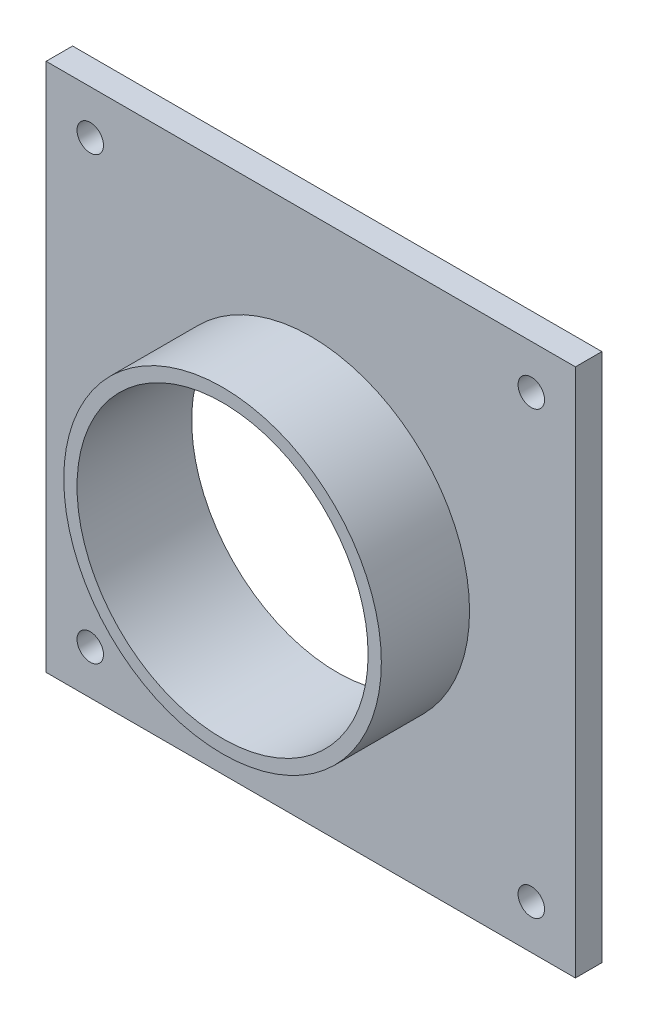
ISO-10303-21;
HEADER;
FILE_DESCRIPTION(('STEP AP214'),'2;1');
FILE_NAME('part.step','',(''),(''),'','','');
FILE_SCHEMA(('AUTOMOTIVE_DESIGN { 1 0 10303 214 1 1 1 1 }'));
ENDSEC;
DATA;
#1=APPLICATION_CONTEXT('core data for automotive mechanical design processes');
#2=APPLICATION_PROTOCOL_DEFINITION('international standard','automotive_design',2000,#1);
#3=PRODUCT_CONTEXT('',#1,'mechanical');
#4=PRODUCT('Part','Part','',(#3));
#5=PRODUCT_RELATED_PRODUCT_CATEGORY('part','',(#4));
#6=PRODUCT_DEFINITION_FORMATION('','',#4);
#7=PRODUCT_DEFINITION_CONTEXT('part definition',#1,'design');
#8=PRODUCT_DEFINITION('design','',#6,#7);
#9=PRODUCT_DEFINITION_SHAPE('','',#8);
#10=(LENGTH_UNIT() NAMED_UNIT(*) SI_UNIT(.MILLI.,.METRE.));
#11=(NAMED_UNIT(*) PLANE_ANGLE_UNIT() SI_UNIT($,.RADIAN.));
#12=(NAMED_UNIT(*) SI_UNIT($,.STERADIAN.) SOLID_ANGLE_UNIT());
#13=UNCERTAINTY_MEASURE_WITH_UNIT(LENGTH_MEASURE(1.E-05),#10,'distance_accuracy_value','');
#14=(GEOMETRIC_REPRESENTATION_CONTEXT(3) GLOBAL_UNCERTAINTY_ASSIGNED_CONTEXT((#13)) GLOBAL_UNIT_ASSIGNED_CONTEXT((#10,
#11,#12)) REPRESENTATION_CONTEXT('',''));
#15=CARTESIAN_POINT('',(0.,0.,0.));
#16=DIRECTION('',(0.,0.,1.));
#17=DIRECTION('',(1.,0.,0.));
#18=AXIS2_PLACEMENT_3D('',#15,#16,#17);
#19=CARTESIAN_POINT('',(0.,0.,3.));
#20=DIRECTION('',(0.,0.,1.));
#21=DIRECTION('',(1.,0.,0.));
#22=AXIS2_PLACEMENT_3D('',#19,#20,#21);
#23=PLANE('',#22);
#24=CARTESIAN_POINT('',(5.,5.,3.));
#25=DIRECTION('',(0.,0.,1.));
#26=DIRECTION('',(-1.,0.,0.));
#27=AXIS2_PLACEMENT_3D('',#24,#25,#26);
#28=CIRCLE('',#27,1.5);
#29=CARTESIAN_POINT('',(3.5,5.,3.));
#30=VERTEX_POINT('',#29);
#31=EDGE_CURVE('E131',#30,#30,#28,.T.);
#32=ORIENTED_EDGE('',*,*,#31,.F.);
#33=EDGE_LOOP('',(#32));
#34=FACE_BOUND('',#33,.T.);
#35=CARTESIAN_POINT('',(55.,55.,3.));
#36=DIRECTION('',(0.,0.,1.));
#37=DIRECTION('',(-1.,0.,0.));
#38=AXIS2_PLACEMENT_3D('',#35,#36,#37);
#39=CIRCLE('',#38,1.5);
#40=CARTESIAN_POINT('',(53.5,55.,3.));
#41=VERTEX_POINT('',#40);
#42=EDGE_CURVE('E119',#41,#41,#39,.T.);
#43=ORIENTED_EDGE('',*,*,#42,.F.);
#44=EDGE_LOOP('',(#43));
#45=FACE_BOUND('',#44,.T.);
#46=DIRECTION('',(0.,-1.,0.));
#47=VECTOR('',#46,1.);
#48=CARTESIAN_POINT('',(0.,60.,3.));
#49=LINE('',#48,#47);
#50=CARTESIAN_POINT('',(0.,60.,3.));
#51=VERTEX_POINT('',#50);
#52=CARTESIAN_POINT('',(0.,0.,3.));
#53=VERTEX_POINT('',#52);
#54=EDGE_CURVE('E86',#51,#53,#49,.T.);
#55=ORIENTED_EDGE('',*,*,#54,.T.);
#56=DIRECTION('',(1.,0.,0.));
#57=VECTOR('',#56,1.);
#58=CARTESIAN_POINT('',(0.,0.,3.));
#59=LINE('',#58,#57);
#60=CARTESIAN_POINT('',(60.,0.,3.));
#61=VERTEX_POINT('',#60);
#62=EDGE_CURVE('E81',#53,#61,#59,.T.);
#63=ORIENTED_EDGE('',*,*,#62,.T.);
#64=DIRECTION('',(0.,1.,0.));
#65=VECTOR('',#64,1.);
#66=CARTESIAN_POINT('',(60.,0.,3.));
#67=LINE('',#66,#65);
#68=CARTESIAN_POINT('',(60.,60.,3.));
#69=VERTEX_POINT('',#68);
#70=EDGE_CURVE('E84',#61,#69,#67,.T.);
#71=ORIENTED_EDGE('',*,*,#70,.T.);
#72=DIRECTION('',(-1.,0.,0.));
#73=VECTOR('',#72,1.);
#74=CARTESIAN_POINT('',(60.,60.,3.));
#75=LINE('',#74,#73);
#76=EDGE_CURVE('E51',#69,#51,#75,.T.);
#77=ORIENTED_EDGE('',*,*,#76,.T.);
#78=EDGE_LOOP('',(#55,#63,#71,#77));
#79=FACE_BOUND('',#78,.T.);
#80=CARTESIAN_POINT('',(5.,55.,3.));
#81=DIRECTION('',(0.,0.,1.));
#82=DIRECTION('',(1.,0.,0.));
#83=AXIS2_PLACEMENT_3D('',#80,#81,#82);
#84=CIRCLE('',#83,1.5);
#85=CARTESIAN_POINT('',(6.5,55.,3.));
#86=VERTEX_POINT('',#85);
#87=EDGE_CURVE('E115',#86,#86,#84,.T.);
#88=ORIENTED_EDGE('',*,*,#87,.F.);
#89=EDGE_LOOP('',(#88));
#90=FACE_BOUND('',#89,.T.);
#91=CARTESIAN_POINT('',(55.,5.,3.));
#92=DIRECTION('',(0.,0.,1.));
#93=DIRECTION('',(1.,0.,0.));
#94=AXIS2_PLACEMENT_3D('',#91,#92,#93);
#95=CIRCLE('',#94,1.5);
#96=CARTESIAN_POINT('',(56.5,5.,3.));
#97=VERTEX_POINT('',#96);
#98=EDGE_CURVE('E125',#97,#97,#95,.T.);
#99=ORIENTED_EDGE('',*,*,#98,.F.);
#100=EDGE_LOOP('',(#99));
#101=FACE_BOUND('',#100,.T.);
#102=CARTESIAN_POINT('',(30.,30.,3.));
#103=DIRECTION('',(0.,0.,1.));
#104=DIRECTION('',(1.,0.,0.));
#105=AXIS2_PLACEMENT_3D('',#102,#103,#104);
#106=CIRCLE('',#105,18.);
#107=CARTESIAN_POINT('',(48.,30.,3.));
#108=VERTEX_POINT('',#107);
#109=EDGE_CURVE('E140',#108,#108,#106,.T.);
#110=ORIENTED_EDGE('',*,*,#109,.F.);
#111=EDGE_LOOP('',(#110));
#112=FACE_BOUND('',#111,.T.);
#113=ADVANCED_FACE('F34',(#34,#45,#79,#90,#101,#112),#23,.T.);
#114=CARTESIAN_POINT('',(0.,0.,0.));
#115=DIRECTION('',(0.,0.,1.));
#116=DIRECTION('',(1.,0.,0.));
#117=AXIS2_PLACEMENT_3D('',#114,#115,#116);
#118=PLANE('',#117);
#119=DIRECTION('',(0.,-1.,0.));
#120=VECTOR('',#119,1.);
#121=CARTESIAN_POINT('',(0.,60.,0.));
#122=LINE('',#121,#120);
#123=CARTESIAN_POINT('',(0.,60.,0.));
#124=VERTEX_POINT('',#123);
#125=CARTESIAN_POINT('',(0.,0.,0.));
#126=VERTEX_POINT('',#125);
#127=EDGE_CURVE('E98',#124,#126,#122,.T.);
#128=ORIENTED_EDGE('',*,*,#127,.F.);
#129=DIRECTION('',(-1.,0.,0.));
#130=VECTOR('',#129,1.);
#131=CARTESIAN_POINT('',(60.,60.,0.));
#132=LINE('',#131,#130);
#133=CARTESIAN_POINT('',(60.,60.,0.));
#134=VERTEX_POINT('',#133);
#135=EDGE_CURVE('E74',#134,#124,#132,.T.);
#136=ORIENTED_EDGE('',*,*,#135,.F.);
#137=DIRECTION('',(0.,1.,0.));
#138=VECTOR('',#137,1.);
#139=CARTESIAN_POINT('',(60.,0.,0.));
#140=LINE('',#139,#138);
#141=CARTESIAN_POINT('',(60.,0.,0.));
#142=VERTEX_POINT('',#141);
#143=EDGE_CURVE('E68',#142,#134,#140,.T.);
#144=ORIENTED_EDGE('',*,*,#143,.F.);
#145=DIRECTION('',(1.,0.,0.));
#146=VECTOR('',#145,1.);
#147=CARTESIAN_POINT('',(0.,0.,0.));
#148=LINE('',#147,#146);
#149=EDGE_CURVE('E90',#126,#142,#148,.T.);
#150=ORIENTED_EDGE('',*,*,#149,.F.);
#151=EDGE_LOOP('',(#128,#136,#144,#150));
#152=FACE_BOUND('',#151,.T.);
#153=CARTESIAN_POINT('',(30.,30.,0.));
#154=DIRECTION('',(0.,0.,1.));
#155=DIRECTION('',(1.,0.,0.));
#156=AXIS2_PLACEMENT_3D('',#153,#154,#155);
#157=CIRCLE('',#156,16.5);
#158=CARTESIAN_POINT('',(46.5,30.,0.));
#159=VERTEX_POINT('',#158);
#160=EDGE_CURVE('E101',#159,#159,#157,.T.);
#161=ORIENTED_EDGE('',*,*,#160,.T.);
#162=EDGE_LOOP('',(#161));
#163=FACE_BOUND('',#162,.T.);
#164=CARTESIAN_POINT('',(5.,55.,0.));
#165=DIRECTION('',(0.,0.,1.));
#166=DIRECTION('',(1.,0.,0.));
#167=AXIS2_PLACEMENT_3D('',#164,#165,#166);
#168=CIRCLE('',#167,1.5);
#169=CARTESIAN_POINT('',(6.5,55.,0.));
#170=VERTEX_POINT('',#169);
#171=EDGE_CURVE('E116',#170,#170,#168,.T.);
#172=ORIENTED_EDGE('',*,*,#171,.T.);
#173=EDGE_LOOP('',(#172));
#174=FACE_BOUND('',#173,.T.);
#175=CARTESIAN_POINT('',(55.,55.,0.));
#176=DIRECTION('',(0.,0.,1.));
#177=DIRECTION('',(-1.,0.,0.));
#178=AXIS2_PLACEMENT_3D('',#175,#176,#177);
#179=CIRCLE('',#178,1.5);
#180=CARTESIAN_POINT('',(53.5,55.,0.));
#181=VERTEX_POINT('',#180);
#182=EDGE_CURVE('E122',#181,#181,#179,.T.);
#183=ORIENTED_EDGE('',*,*,#182,.T.);
#184=EDGE_LOOP('',(#183));
#185=FACE_BOUND('',#184,.T.);
#186=CARTESIAN_POINT('',(55.,5.,0.));
#187=DIRECTION('',(0.,0.,1.));
#188=DIRECTION('',(1.,0.,0.));
#189=AXIS2_PLACEMENT_3D('',#186,#187,#188);
#190=CIRCLE('',#189,1.5);
#191=CARTESIAN_POINT('',(56.5,5.,0.));
#192=VERTEX_POINT('',#191);
#193=EDGE_CURVE('E128',#192,#192,#190,.T.);
#194=ORIENTED_EDGE('',*,*,#193,.T.);
#195=EDGE_LOOP('',(#194));
#196=FACE_BOUND('',#195,.T.);
#197=CARTESIAN_POINT('',(5.,5.,0.));
#198=DIRECTION('',(0.,0.,1.));
#199=DIRECTION('',(-1.,0.,0.));
#200=AXIS2_PLACEMENT_3D('',#197,#198,#199);
#201=CIRCLE('',#200,1.5);
#202=CARTESIAN_POINT('',(3.5,5.,0.));
#203=VERTEX_POINT('',#202);
#204=EDGE_CURVE('E134',#203,#203,#201,.T.);
#205=ORIENTED_EDGE('',*,*,#204,.T.);
#206=EDGE_LOOP('',(#205));
#207=FACE_BOUND('',#206,.T.);
#208=ADVANCED_FACE('F109',(#152,#163,#174,#185,#196,#207),#118,.F.);
#209=CARTESIAN_POINT('',(0.,60.,3.));
#210=DIRECTION('',(1.,0.,0.));
#211=DIRECTION('',(0.,1.,0.));
#212=AXIS2_PLACEMENT_3D('',#209,#210,#211);
#213=PLANE('',#212);
#214=ORIENTED_EDGE('',*,*,#127,.T.);
#215=DIRECTION('',(0.,0.,-1.));
#216=VECTOR('',#215,1.);
#217=CARTESIAN_POINT('',(0.,0.,3.));
#218=LINE('',#217,#216);
#219=EDGE_CURVE('E11',#53,#126,#218,.T.);
#220=ORIENTED_EDGE('',*,*,#219,.F.);
#221=ORIENTED_EDGE('',*,*,#54,.F.);
#222=DIRECTION('',(0.,0.,-1.));
#223=VECTOR('',#222,1.);
#224=CARTESIAN_POINT('',(0.,60.,3.));
#225=LINE('',#224,#223);
#226=EDGE_CURVE('E94',#51,#124,#225,.T.);
#227=ORIENTED_EDGE('',*,*,#226,.T.);
#228=EDGE_LOOP('',(#214,#220,#221,#227));
#229=FACE_BOUND('',#228,.T.);
#230=ADVANCED_FACE('F36',(#229),#213,.F.);
#231=CARTESIAN_POINT('',(0.,0.,3.));
#232=DIRECTION('',(0.,1.,0.));
#233=DIRECTION('',(-1.,0.,0.));
#234=AXIS2_PLACEMENT_3D('',#231,#232,#233);
#235=PLANE('',#234);
#236=ORIENTED_EDGE('',*,*,#149,.T.);
#237=DIRECTION('',(0.,0.,-1.));
#238=VECTOR('',#237,1.);
#239=CARTESIAN_POINT('',(60.,0.,3.));
#240=LINE('',#239,#238);
#241=EDGE_CURVE('E43',#61,#142,#240,.T.);
#242=ORIENTED_EDGE('',*,*,#241,.F.);
#243=ORIENTED_EDGE('',*,*,#62,.F.);
#244=ORIENTED_EDGE('',*,*,#219,.T.);
#245=EDGE_LOOP('',(#236,#242,#243,#244));
#246=FACE_BOUND('',#245,.T.);
#247=ADVANCED_FACE('F89',(#246),#235,.F.);
#248=CARTESIAN_POINT('',(60.,0.,3.));
#249=DIRECTION('',(-1.,0.,0.));
#250=DIRECTION('',(0.,0.,1.));
#251=AXIS2_PLACEMENT_3D('',#248,#249,#250);
#252=PLANE('',#251);
#253=ORIENTED_EDGE('',*,*,#143,.T.);
#254=DIRECTION('',(0.,0.,-1.));
#255=VECTOR('',#254,1.);
#256=CARTESIAN_POINT('',(60.,60.,3.));
#257=LINE('',#256,#255);
#258=EDGE_CURVE('E91',#69,#134,#257,.T.);
#259=ORIENTED_EDGE('',*,*,#258,.F.);
#260=ORIENTED_EDGE('',*,*,#70,.F.);
#261=ORIENTED_EDGE('',*,*,#241,.T.);
#262=EDGE_LOOP('',(#253,#259,#260,#261));
#263=FACE_BOUND('',#262,.T.);
#264=ADVANCED_FACE('F92',(#263),#252,.F.);
#265=CARTESIAN_POINT('',(60.,60.,3.));
#266=DIRECTION('',(0.,-1.,0.));
#267=DIRECTION('',(0.,0.,-1.));
#268=AXIS2_PLACEMENT_3D('',#265,#266,#267);
#269=PLANE('',#268);
#270=ORIENTED_EDGE('',*,*,#135,.T.);
#271=ORIENTED_EDGE('',*,*,#226,.F.);
#272=ORIENTED_EDGE('',*,*,#76,.F.);
#273=ORIENTED_EDGE('',*,*,#258,.T.);
#274=EDGE_LOOP('',(#270,#271,#272,#273));
#275=FACE_BOUND('',#274,.T.);
#276=ADVANCED_FACE('F106',(#275),#269,.F.);
#277=CARTESIAN_POINT('',(30.,30.,3.));
#278=DIRECTION('',(0.,0.,-1.));
#279=DIRECTION('',(-1.,0.,0.));
#280=AXIS2_PLACEMENT_3D('',#277,#278,#279);
#281=CYLINDRICAL_SURFACE('',#280,16.5);
#282=ORIENTED_EDGE('',*,*,#160,.F.);
#283=EDGE_LOOP('',(#282));
#284=FACE_BOUND('',#283,.T.);
#285=CARTESIAN_POINT('',(30.,30.,13.));
#286=DIRECTION('',(0.,0.,1.));
#287=DIRECTION('',(1.,0.,0.));
#288=AXIS2_PLACEMENT_3D('',#285,#286,#287);
#289=CIRCLE('',#288,16.5);
#290=CARTESIAN_POINT('',(46.5,30.,13.));
#291=VERTEX_POINT('',#290);
#292=EDGE_CURVE('E143',#291,#291,#289,.T.);
#293=ORIENTED_EDGE('',*,*,#292,.T.);
#294=EDGE_LOOP('',(#293));
#295=FACE_BOUND('',#294,.T.);
#296=ADVANCED_FACE('F149',(#284,#295),#281,.F.);
#297=CARTESIAN_POINT('',(5.,55.,3.));
#298=DIRECTION('',(0.,0.,-1.));
#299=DIRECTION('',(-1.,0.,0.));
#300=AXIS2_PLACEMENT_3D('',#297,#298,#299);
#301=CYLINDRICAL_SURFACE('',#300,1.5);
#302=ORIENTED_EDGE('',*,*,#87,.T.);
#303=EDGE_LOOP('',(#302));
#304=FACE_BOUND('',#303,.T.);
#305=ORIENTED_EDGE('',*,*,#171,.F.);
#306=EDGE_LOOP('',(#305));
#307=FACE_BOUND('',#306,.T.);
#308=ADVANCED_FACE('F218',(#304,#307),#301,.F.);
#309=CARTESIAN_POINT('',(55.,55.,3.));
#310=DIRECTION('',(0.,0.,-1.));
#311=DIRECTION('',(-1.,0.,0.));
#312=AXIS2_PLACEMENT_3D('',#309,#310,#311);
#313=CYLINDRICAL_SURFACE('',#312,1.5);
#314=ORIENTED_EDGE('',*,*,#42,.T.);
#315=EDGE_LOOP('',(#314));
#316=FACE_BOUND('',#315,.T.);
#317=ORIENTED_EDGE('',*,*,#182,.F.);
#318=EDGE_LOOP('',(#317));
#319=FACE_BOUND('',#318,.T.);
#320=ADVANCED_FACE('F229',(#316,#319),#313,.F.);
#321=CARTESIAN_POINT('',(55.,5.,3.));
#322=DIRECTION('',(0.,0.,-1.));
#323=DIRECTION('',(-1.,0.,0.));
#324=AXIS2_PLACEMENT_3D('',#321,#322,#323);
#325=CYLINDRICAL_SURFACE('',#324,1.5);
#326=ORIENTED_EDGE('',*,*,#98,.T.);
#327=EDGE_LOOP('',(#326));
#328=FACE_BOUND('',#327,.T.);
#329=ORIENTED_EDGE('',*,*,#193,.F.);
#330=EDGE_LOOP('',(#329));
#331=FACE_BOUND('',#330,.T.);
#332=ADVANCED_FACE('F163',(#328,#331),#325,.F.);
#333=CARTESIAN_POINT('',(5.,5.,3.));
#334=DIRECTION('',(0.,0.,-1.));
#335=DIRECTION('',(-1.,0.,0.));
#336=AXIS2_PLACEMENT_3D('',#333,#334,#335);
#337=CYLINDRICAL_SURFACE('',#336,1.5);
#338=ORIENTED_EDGE('',*,*,#31,.T.);
#339=EDGE_LOOP('',(#338));
#340=FACE_BOUND('',#339,.T.);
#341=ORIENTED_EDGE('',*,*,#204,.F.);
#342=EDGE_LOOP('',(#341));
#343=FACE_BOUND('',#342,.T.);
#344=ADVANCED_FACE('F154',(#340,#343),#337,.F.);
#345=CARTESIAN_POINT('',(30.,30.,13.));
#346=DIRECTION('',(0.,0.,1.));
#347=DIRECTION('',(1.,0.,0.));
#348=AXIS2_PLACEMENT_3D('',#345,#346,#347);
#349=PLANE('',#348);
#350=CARTESIAN_POINT('',(30.,30.,13.));
#351=DIRECTION('',(0.,0.,1.));
#352=DIRECTION('',(1.,0.,0.));
#353=AXIS2_PLACEMENT_3D('',#350,#351,#352);
#354=CIRCLE('',#353,18.);
#355=CARTESIAN_POINT('',(48.,30.,13.));
#356=VERTEX_POINT('',#355);
#357=EDGE_CURVE('E137',#356,#356,#354,.T.);
#358=ORIENTED_EDGE('',*,*,#357,.T.);
#359=EDGE_LOOP('',(#358));
#360=FACE_BOUND('',#359,.T.);
#361=ORIENTED_EDGE('',*,*,#292,.F.);
#362=EDGE_LOOP('',(#361));
#363=FACE_BOUND('',#362,.T.);
#364=ADVANCED_FACE('F151',(#360,#363),#349,.T.);
#365=CARTESIAN_POINT('',(30.,30.,13.));
#366=DIRECTION('',(0.,0.,-1.));
#367=DIRECTION('',(-1.,0.,0.));
#368=AXIS2_PLACEMENT_3D('',#365,#366,#367);
#369=CYLINDRICAL_SURFACE('',#368,18.);
#370=ORIENTED_EDGE('',*,*,#357,.F.);
#371=EDGE_LOOP('',(#370));
#372=FACE_BOUND('',#371,.T.);
#373=ORIENTED_EDGE('',*,*,#109,.T.);
#374=EDGE_LOOP('',(#373));
#375=FACE_BOUND('',#374,.T.);
#376=ADVANCED_FACE('F153',(#372,#375),#369,.T.);
#377=CLOSED_SHELL('',(#113,#208,#230,#247,#264,#276,#296,#308,#320,#332,#344,#364,#376));
#378=MANIFOLD_SOLID_BREP('B2',#377);
#379=ADVANCED_BREP_SHAPE_REPRESENTATION('',(#18,#378),#14);
#380=SHAPE_DEFINITION_REPRESENTATION(#9,#379);
ENDSEC;
END-ISO-10303-21;
